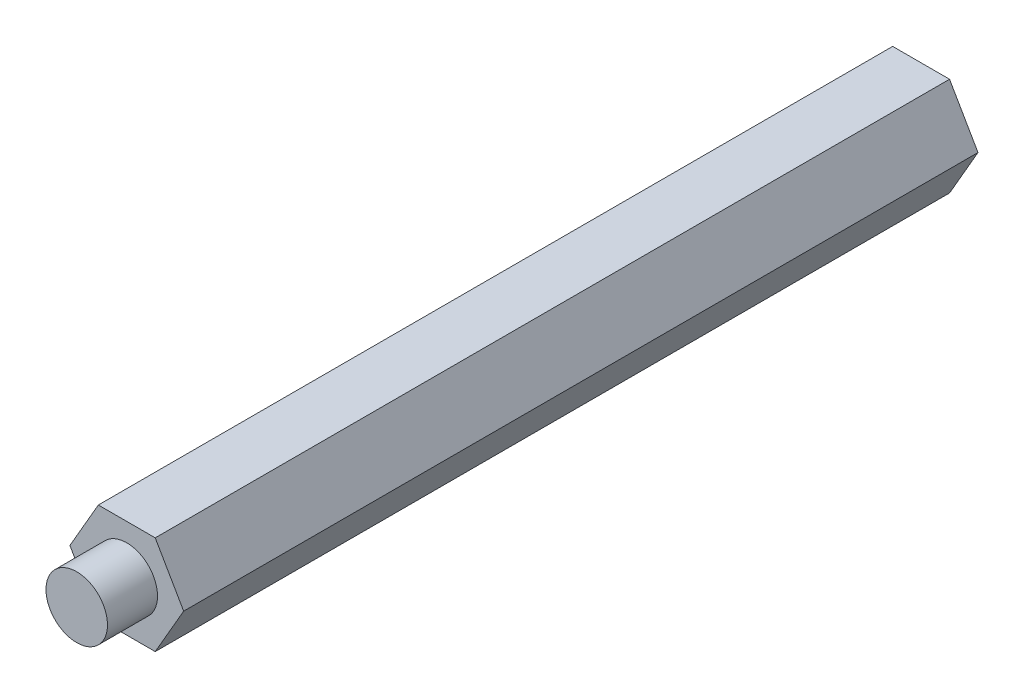
ISO-10303-21;
HEADER;
FILE_DESCRIPTION(('STEP AP214'),'2;1');
FILE_NAME('part.step','',(''),(''),'','','');
FILE_SCHEMA(('AUTOMOTIVE_DESIGN { 1 0 10303 214 1 1 1 1 }'));
ENDSEC;
DATA;
#1=APPLICATION_CONTEXT('core data for automotive mechanical design processes');
#2=APPLICATION_PROTOCOL_DEFINITION('international standard','automotive_design',2000,#1);
#3=PRODUCT_CONTEXT('',#1,'mechanical');
#4=PRODUCT('Part','Part','',(#3));
#5=PRODUCT_RELATED_PRODUCT_CATEGORY('part','',(#4));
#6=PRODUCT_DEFINITION_FORMATION('','',#4);
#7=PRODUCT_DEFINITION_CONTEXT('part definition',#1,'design');
#8=PRODUCT_DEFINITION('design','',#6,#7);
#9=PRODUCT_DEFINITION_SHAPE('','',#8);
#10=(LENGTH_UNIT() NAMED_UNIT(*) SI_UNIT(.MILLI.,.METRE.));
#11=(NAMED_UNIT(*) PLANE_ANGLE_UNIT() SI_UNIT($,.RADIAN.));
#12=(NAMED_UNIT(*) SI_UNIT($,.STERADIAN.) SOLID_ANGLE_UNIT());
#13=UNCERTAINTY_MEASURE_WITH_UNIT(LENGTH_MEASURE(1.E-05),#10,'distance_accuracy_value','');
#14=(GEOMETRIC_REPRESENTATION_CONTEXT(3) GLOBAL_UNCERTAINTY_ASSIGNED_CONTEXT((#13)) GLOBAL_UNIT_ASSIGNED_CONTEXT((#10,
#11,#12)) REPRESENTATION_CONTEXT('',''));
#15=CARTESIAN_POINT('',(0.,0.,0.));
#16=DIRECTION('',(0.,0.,1.));
#17=DIRECTION('',(1.,0.,0.));
#18=AXIS2_PLACEMENT_3D('',#15,#16,#17);
#19=CARTESIAN_POINT('',(0.,0.,0.));
#20=DIRECTION('',(0.,0.,1.));
#21=DIRECTION('',(1.,0.,0.));
#22=AXIS2_PLACEMENT_3D('',#19,#20,#21);
#23=PLANE('',#22);
#24=DIRECTION('',(0.5,0.866025403784438,0.));
#25=VECTOR('',#24,1.);
#26=CARTESIAN_POINT('',(1.80421959121758,-3.125,0.));
#27=LINE('',#26,#25);
#28=CARTESIAN_POINT('',(1.80421959121758,-3.125,0.));
#29=VERTEX_POINT('',#28);
#30=CARTESIAN_POINT('',(3.60843918243516,0.,0.));
#31=VERTEX_POINT('',#30);
#32=EDGE_CURVE('E99',#29,#31,#27,.T.);
#33=ORIENTED_EDGE('',*,*,#32,.F.);
#34=DIRECTION('',(1.,0.,0.));
#35=VECTOR('',#34,1.);
#36=CARTESIAN_POINT('',(-1.80421959121758,-3.125,0.));
#37=LINE('',#36,#35);
#38=CARTESIAN_POINT('',(-1.80421959121758,-3.125,0.));
#39=VERTEX_POINT('',#38);
#40=EDGE_CURVE('E121',#39,#29,#37,.T.);
#41=ORIENTED_EDGE('',*,*,#40,.F.);
#42=DIRECTION('',(0.5,-0.866025403784439,0.));
#43=VECTOR('',#42,1.);
#44=CARTESIAN_POINT('',(-3.60843918243516,0.,0.));
#45=LINE('',#44,#43);
#46=CARTESIAN_POINT('',(-3.60843918243516,0.,0.));
#47=VERTEX_POINT('',#46);
#48=EDGE_CURVE('E118',#47,#39,#45,.T.);
#49=ORIENTED_EDGE('',*,*,#48,.F.);
#50=DIRECTION('',(-0.5,-0.866025403784439,0.));
#51=VECTOR('',#50,1.);
#52=CARTESIAN_POINT('',(-1.80421959121758,3.125,0.));
#53=LINE('',#52,#51);
#54=CARTESIAN_POINT('',(-1.80421959121758,3.125,0.));
#55=VERTEX_POINT('',#54);
#56=EDGE_CURVE('E115',#55,#47,#53,.T.);
#57=ORIENTED_EDGE('',*,*,#56,.F.);
#58=DIRECTION('',(-1.,0.,0.));
#59=VECTOR('',#58,1.);
#60=CARTESIAN_POINT('',(1.80421959121758,3.125,0.));
#61=LINE('',#60,#59);
#62=CARTESIAN_POINT('',(1.80421959121758,3.125,0.));
#63=VERTEX_POINT('',#62);
#64=EDGE_CURVE('E102',#63,#55,#61,.T.);
#65=ORIENTED_EDGE('',*,*,#64,.F.);
#66=DIRECTION('',(-0.5,0.866025403784438,0.));
#67=VECTOR('',#66,1.);
#68=CARTESIAN_POINT('',(3.60843918243516,0.,0.));
#69=LINE('',#68,#67);
#70=EDGE_CURVE('E90',#31,#63,#69,.T.);
#71=ORIENTED_EDGE('',*,*,#70,.F.);
#72=EDGE_LOOP('',(#33,#41,#49,#57,#65,#71));
#73=FACE_BOUND('',#72,.T.);
#74=ADVANCED_FACE('F33',(#73),#23,.F.);
#75=CARTESIAN_POINT('',(-1.80421959121758,-3.125,59.9320326978247));
#76=DIRECTION('',(0.,1.,0.));
#77=DIRECTION('',(0.,0.,1.));
#78=AXIS2_PLACEMENT_3D('',#75,#76,#77);
#79=PLANE('',#78);
#80=DIRECTION('',(0.,0.,-1.));
#81=VECTOR('',#80,1.);
#82=CARTESIAN_POINT('',(1.80421959121758,-3.125,59.9320326978247));
#83=LINE('',#82,#81);
#84=CARTESIAN_POINT('',(1.80421959121758,-3.125,50.385));
#85=VERTEX_POINT('',#84);
#86=EDGE_CURVE('E105',#85,#29,#83,.T.);
#87=ORIENTED_EDGE('',*,*,#86,.F.);
#88=DIRECTION('',(-1.,0.,0.));
#89=VECTOR('',#88,1.);
#90=CARTESIAN_POINT('',(-1.80421959121758,-3.125,50.385));
#91=LINE('',#90,#89);
#92=CARTESIAN_POINT('',(-1.80421959121758,-3.125,50.385));
#93=VERTEX_POINT('',#92);
#94=EDGE_CURVE('E37',#85,#93,#91,.T.);
#95=ORIENTED_EDGE('',*,*,#94,.T.);
#96=DIRECTION('',(0.,0.,-1.));
#97=VECTOR('',#96,1.);
#98=CARTESIAN_POINT('',(-1.80421959121758,-3.125,59.9320326978247));
#99=LINE('',#98,#97);
#100=EDGE_CURVE('E124',#93,#39,#99,.T.);
#101=ORIENTED_EDGE('',*,*,#100,.T.);
#102=ORIENTED_EDGE('',*,*,#40,.T.);
#103=EDGE_LOOP('',(#87,#95,#101,#102));
#104=FACE_BOUND('',#103,.T.);
#105=ADVANCED_FACE('F143',(#104),#79,.F.);
#106=CARTESIAN_POINT('',(-3.60843918243516,0.,59.9320326978247));
#107=DIRECTION('',(0.866025403784439,0.5,0.));
#108=DIRECTION('',(-0.5,0.866025403784439,0.));
#109=AXIS2_PLACEMENT_3D('',#106,#107,#108);
#110=PLANE('',#109);
#111=ORIENTED_EDGE('',*,*,#100,.F.);
#112=DIRECTION('',(-0.5,0.866025403784439,0.));
#113=VECTOR('',#112,1.);
#114=CARTESIAN_POINT('',(-3.60843918243521,0.,50.385));
#115=LINE('',#114,#113);
#116=CARTESIAN_POINT('',(-3.60843918243516,0.,50.385));
#117=VERTEX_POINT('',#116);
#118=EDGE_CURVE('E135',#93,#117,#115,.T.);
#119=ORIENTED_EDGE('',*,*,#118,.T.);
#120=DIRECTION('',(0.,0.,-1.));
#121=VECTOR('',#120,1.);
#122=CARTESIAN_POINT('',(-3.60843918243516,0.,59.9320326978247));
#123=LINE('',#122,#121);
#124=EDGE_CURVE('E126',#117,#47,#123,.T.);
#125=ORIENTED_EDGE('',*,*,#124,.T.);
#126=ORIENTED_EDGE('',*,*,#48,.T.);
#127=EDGE_LOOP('',(#111,#119,#125,#126));
#128=FACE_BOUND('',#127,.T.);
#129=ADVANCED_FACE('F146',(#128),#110,.F.);
#130=CARTESIAN_POINT('',(-1.80421959121758,3.125,59.9320326978247));
#131=DIRECTION('',(0.866025403784439,-0.5,0.));
#132=DIRECTION('',(0.5,0.866025403784439,0.));
#133=AXIS2_PLACEMENT_3D('',#130,#131,#132);
#134=PLANE('',#133);
#135=ORIENTED_EDGE('',*,*,#124,.F.);
#136=DIRECTION('',(0.5,0.866025403784439,0.));
#137=VECTOR('',#136,1.);
#138=CARTESIAN_POINT('',(-1.80421959121753,3.12500000000009,50.385));
#139=LINE('',#138,#137);
#140=CARTESIAN_POINT('',(-1.80421959121758,3.125,50.385));
#141=VERTEX_POINT('',#140);
#142=EDGE_CURVE('E133',#117,#141,#139,.T.);
#143=ORIENTED_EDGE('',*,*,#142,.T.);
#144=DIRECTION('',(0.,0.,-1.));
#145=VECTOR('',#144,1.);
#146=CARTESIAN_POINT('',(-1.80421959121758,3.125,59.9320326978247));
#147=LINE('',#146,#145);
#148=EDGE_CURVE('E128',#141,#55,#147,.T.);
#149=ORIENTED_EDGE('',*,*,#148,.T.);
#150=ORIENTED_EDGE('',*,*,#56,.T.);
#151=EDGE_LOOP('',(#135,#143,#149,#150));
#152=FACE_BOUND('',#151,.T.);
#153=ADVANCED_FACE('F149',(#152),#134,.F.);
#154=CARTESIAN_POINT('',(1.80421959121758,3.125,59.9320326978247));
#155=DIRECTION('',(0.,-1.,0.));
#156=DIRECTION('',(0.,0.,-1.));
#157=AXIS2_PLACEMENT_3D('',#154,#155,#156);
#158=PLANE('',#157);
#159=ORIENTED_EDGE('',*,*,#148,.F.);
#160=DIRECTION('',(1.,0.,0.));
#161=VECTOR('',#160,1.);
#162=CARTESIAN_POINT('',(1.80421959121758,3.125,50.385));
#163=LINE('',#162,#161);
#164=CARTESIAN_POINT('',(1.80421959121758,3.125,50.385));
#165=VERTEX_POINT('',#164);
#166=EDGE_CURVE('E55',#141,#165,#163,.T.);
#167=ORIENTED_EDGE('',*,*,#166,.T.);
#168=DIRECTION('',(0.,0.,-1.));
#169=VECTOR('',#168,1.);
#170=CARTESIAN_POINT('',(1.80421959121758,3.125,59.9320326978247));
#171=LINE('',#170,#169);
#172=EDGE_CURVE('E95',#165,#63,#171,.T.);
#173=ORIENTED_EDGE('',*,*,#172,.T.);
#174=ORIENTED_EDGE('',*,*,#64,.T.);
#175=EDGE_LOOP('',(#159,#167,#173,#174));
#176=FACE_BOUND('',#175,.T.);
#177=ADVANCED_FACE('F131',(#176),#158,.F.);
#178=CARTESIAN_POINT('',(3.60843918243516,0.,59.9320326978247));
#179=DIRECTION('',(-0.866025403784438,-0.5,0.));
#180=DIRECTION('',(0.5,-0.866025403784438,0.));
#181=AXIS2_PLACEMENT_3D('',#178,#179,#180);
#182=PLANE('',#181);
#183=ORIENTED_EDGE('',*,*,#172,.F.);
#184=DIRECTION('',(0.5,-0.866025403784438,0.));
#185=VECTOR('',#184,1.);
#186=CARTESIAN_POINT('',(3.60843918243511,0.,50.385));
#187=LINE('',#186,#185);
#188=CARTESIAN_POINT('',(3.60843918243516,0.,50.385));
#189=VERTEX_POINT('',#188);
#190=EDGE_CURVE('E50',#165,#189,#187,.T.);
#191=ORIENTED_EDGE('',*,*,#190,.T.);
#192=DIRECTION('',(0.,0.,-1.));
#193=VECTOR('',#192,1.);
#194=CARTESIAN_POINT('',(3.60843918243516,0.,59.9320326978247));
#195=LINE('',#194,#193);
#196=EDGE_CURVE('E87',#189,#31,#195,.T.);
#197=ORIENTED_EDGE('',*,*,#196,.T.);
#198=ORIENTED_EDGE('',*,*,#70,.T.);
#199=EDGE_LOOP('',(#183,#191,#197,#198));
#200=FACE_BOUND('',#199,.T.);
#201=ADVANCED_FACE('F89',(#200),#182,.F.);
#202=CARTESIAN_POINT('',(1.80421959121758,-3.125,59.9320326978247));
#203=DIRECTION('',(-0.866025403784439,0.5,0.));
#204=DIRECTION('',(-0.5,-0.866025403784439,0.));
#205=AXIS2_PLACEMENT_3D('',#202,#203,#204);
#206=PLANE('',#205);
#207=ORIENTED_EDGE('',*,*,#196,.F.);
#208=DIRECTION('',(-0.5,-0.866025403784439,0.));
#209=VECTOR('',#208,1.);
#210=CARTESIAN_POINT('',(1.80421959121763,-3.12499999999992,50.385));
#211=LINE('',#210,#209);
#212=EDGE_CURVE('E42',#189,#85,#211,.T.);
#213=ORIENTED_EDGE('',*,*,#212,.T.);
#214=ORIENTED_EDGE('',*,*,#86,.T.);
#215=ORIENTED_EDGE('',*,*,#32,.T.);
#216=EDGE_LOOP('',(#207,#213,#214,#215));
#217=FACE_BOUND('',#216,.T.);
#218=ADVANCED_FACE('F35',(#217),#206,.F.);
#219=CARTESIAN_POINT('',(-0.854597541410192,3.18940144456648,50.385));
#220=DIRECTION('',(0.,0.,-1.));
#221=DIRECTION('',(-0.965925826289072,-0.258819045102508,0.));
#222=AXIS2_PLACEMENT_3D('',#219,#220,#221);
#223=PLANE('',#222);
#224=CARTESIAN_POINT('',(0.,0.,50.385));
#225=DIRECTION('',(0.,0.,1.));
#226=DIRECTION('',(1.,0.,0.));
#227=AXIS2_PLACEMENT_3D('',#224,#225,#226);
#228=CIRCLE('',#227,1.95);
#229=CARTESIAN_POINT('',(1.95,0.,50.385));
#230=VERTEX_POINT('',#229);
#231=EDGE_CURVE('E11',#230,#230,#228,.T.);
#232=ORIENTED_EDGE('',*,*,#231,.F.);
#233=EDGE_LOOP('',(#232));
#234=FACE_BOUND('',#233,.T.);
#235=ORIENTED_EDGE('',*,*,#190,.F.);
#236=ORIENTED_EDGE('',*,*,#166,.F.);
#237=ORIENTED_EDGE('',*,*,#142,.F.);
#238=ORIENTED_EDGE('',*,*,#118,.F.);
#239=ORIENTED_EDGE('',*,*,#94,.F.);
#240=ORIENTED_EDGE('',*,*,#212,.F.);
#241=EDGE_LOOP('',(#235,#236,#237,#238,#239,#240));
#242=FACE_BOUND('',#241,.T.);
#243=ADVANCED_FACE('F144',(#234,#242),#223,.F.);
#244=CARTESIAN_POINT('',(0.,0.,59.0754328932551));
#245=DIRECTION('',(0.,0.,-1.));
#246=DIRECTION('',(-1.,0.,0.));
#247=AXIS2_PLACEMENT_3D('',#244,#245,#246);
#248=CYLINDRICAL_SURFACE('',#247,1.95);
#249=ORIENTED_EDGE('',*,*,#231,.T.);
#250=EDGE_LOOP('',(#249));
#251=FACE_BOUND('',#250,.T.);
#252=CARTESIAN_POINT('',(0.,0.,53.56));
#253=DIRECTION('',(0.,0.,1.));
#254=DIRECTION('',(0.,-1.,0.));
#255=AXIS2_PLACEMENT_3D('',#252,#253,#254);
#256=CIRCLE('',#255,1.95);
#257=CARTESIAN_POINT('',(0.,-1.95,53.56));
#258=VERTEX_POINT('',#257);
#259=EDGE_CURVE('E107',#258,#258,#256,.T.);
#260=ORIENTED_EDGE('',*,*,#259,.F.);
#261=EDGE_LOOP('',(#260));
#262=FACE_BOUND('',#261,.T.);
#263=ADVANCED_FACE('F167',(#251,#262),#248,.T.);
#264=CARTESIAN_POINT('',(-1.06825266314231,3.98677321416807,53.5600000000001));
#265=DIRECTION('',(0.,0.,1.));
#266=DIRECTION('',(0.965925826289072,0.258819045102508,0.));
#267=AXIS2_PLACEMENT_3D('',#264,#265,#266);
#268=PLANE('',#267);
#269=ORIENTED_EDGE('',*,*,#259,.T.);
#270=EDGE_LOOP('',(#269));
#271=FACE_BOUND('',#270,.T.);
#272=ADVANCED_FACE('F169',(#271),#268,.T.);
#273=CLOSED_SHELL('',(#74,#105,#129,#153,#177,#201,#218,#243,#263,#272));
#274=MANIFOLD_SOLID_BREP('B2',#273);
#275=ADVANCED_BREP_SHAPE_REPRESENTATION('',(#18,#274),#14);
#276=SHAPE_DEFINITION_REPRESENTATION(#9,#275);
ENDSEC;
END-ISO-10303-21;
